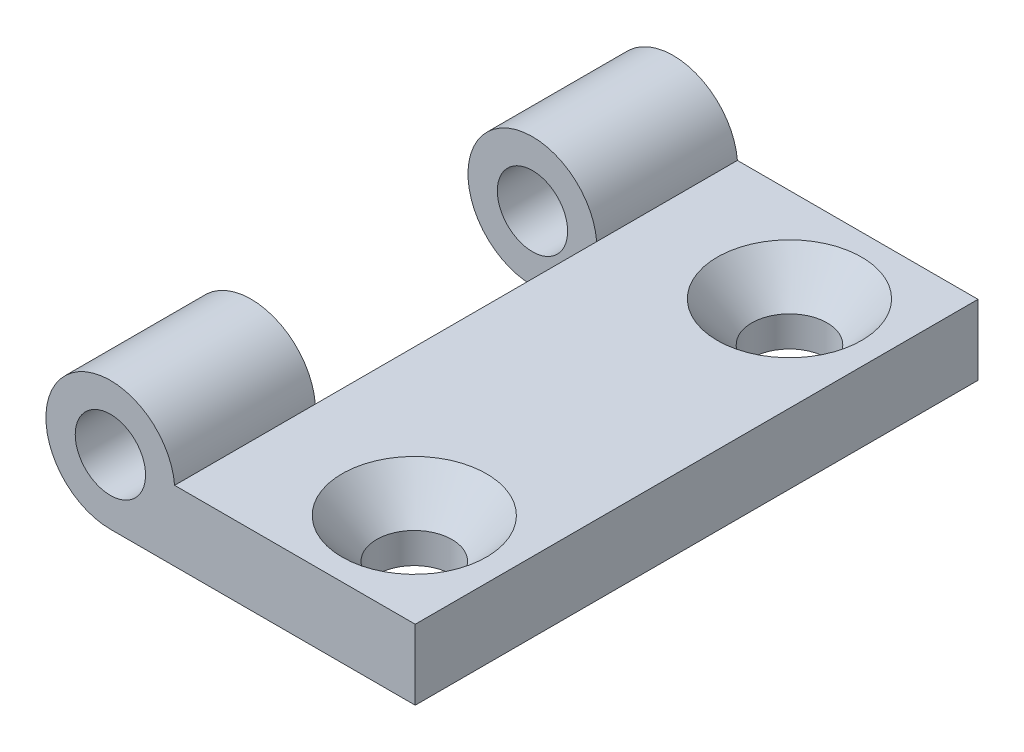
ISO-10303-21;
HEADER;
FILE_DESCRIPTION(('STEP AP214'),'2;1');
FILE_NAME('part.step','',(''),(''),'','','');
FILE_SCHEMA(('AUTOMOTIVE_DESIGN { 1 0 10303 214 1 1 1 1 }'));
ENDSEC;
DATA;
#1=APPLICATION_CONTEXT('core data for automotive mechanical design processes');
#2=APPLICATION_PROTOCOL_DEFINITION('international standard','automotive_design',2000,#1);
#3=PRODUCT_CONTEXT('',#1,'mechanical');
#4=PRODUCT('Part','Part','',(#3));
#5=PRODUCT_RELATED_PRODUCT_CATEGORY('part','',(#4));
#6=PRODUCT_DEFINITION_FORMATION('','',#4);
#7=PRODUCT_DEFINITION_CONTEXT('part definition',#1,'design');
#8=PRODUCT_DEFINITION('design','',#6,#7);
#9=PRODUCT_DEFINITION_SHAPE('','',#8);
#10=(LENGTH_UNIT() NAMED_UNIT(*) SI_UNIT(.MILLI.,.METRE.));
#11=(NAMED_UNIT(*) PLANE_ANGLE_UNIT() SI_UNIT($,.RADIAN.));
#12=(NAMED_UNIT(*) SI_UNIT($,.STERADIAN.) SOLID_ANGLE_UNIT());
#13=UNCERTAINTY_MEASURE_WITH_UNIT(LENGTH_MEASURE(1.E-05),#10,'distance_accuracy_value','');
#14=(GEOMETRIC_REPRESENTATION_CONTEXT(3) GLOBAL_UNCERTAINTY_ASSIGNED_CONTEXT((#13)) GLOBAL_UNIT_ASSIGNED_CONTEXT((#10,
#11,#12)) REPRESENTATION_CONTEXT('',''));
#15=CARTESIAN_POINT('',(0.,0.,0.));
#16=DIRECTION('',(0.,0.,1.));
#17=DIRECTION('',(1.,0.,0.));
#18=AXIS2_PLACEMENT_3D('',#15,#16,#17);
#19=CARTESIAN_POINT('',(0.,4.365625,19.05));
#20=DIRECTION('',(0.,0.,-1.));
#21=DIRECTION('',(-1.,0.,0.));
#22=AXIS2_PLACEMENT_3D('',#19,#20,#21);
#23=CYLINDRICAL_SURFACE('',#22,4.365625);
#24=CARTESIAN_POINT('',(0.,4.365625,-9.525));
#25=DIRECTION('',(0.,0.,-1.));
#26=DIRECTION('',(-1.,0.,0.));
#27=AXIS2_PLACEMENT_3D('',#24,#25,#26);
#28=CIRCLE('',#27,4.365625);
#29=CARTESIAN_POINT('',(0.,0.,-9.525));
#30=VERTEX_POINT('',#29);
#31=CARTESIAN_POINT('',(4.34868844710678,4.7498,-9.525));
#32=VERTEX_POINT('',#31);
#33=EDGE_CURVE('E107',#30,#32,#28,.T.);
#34=ORIENTED_EDGE('',*,*,#33,.T.);
#35=DIRECTION('',(0.,0.,-1.));
#36=VECTOR('',#35,1.);
#37=CARTESIAN_POINT('',(4.34868844710678,4.7498,19.05));
#38=LINE('',#37,#36);
#39=CARTESIAN_POINT('',(4.34868844710678,4.7498,-19.05));
#40=VERTEX_POINT('',#39);
#41=EDGE_CURVE('E112',#32,#40,#38,.T.);
#42=ORIENTED_EDGE('',*,*,#41,.T.);
#43=CARTESIAN_POINT('',(0.,4.365625,-19.05));
#44=DIRECTION('',(0.,0.,1.));
#45=DIRECTION('',(-1.,0.,0.));
#46=AXIS2_PLACEMENT_3D('',#43,#44,#45);
#47=CIRCLE('',#46,4.365625);
#48=CARTESIAN_POINT('',(0.,0.,-19.05));
#49=VERTEX_POINT('',#48);
#50=EDGE_CURVE('E169',#40,#49,#47,.T.);
#51=ORIENTED_EDGE('',*,*,#50,.T.);
#52=DIRECTION('',(0.,0.,-1.));
#53=VECTOR('',#52,1.);
#54=CARTESIAN_POINT('',(0.,0.,19.05));
#55=LINE('',#54,#53);
#56=EDGE_CURVE('E114',#30,#49,#55,.T.);
#57=ORIENTED_EDGE('',*,*,#56,.F.);
#58=EDGE_LOOP('',(#34,#42,#51,#57));
#59=FACE_BOUND('',#58,.T.);
#60=ADVANCED_FACE('F34',(#59),#23,.T.);
#61=CARTESIAN_POINT('',(0.,4.365625,19.05));
#62=DIRECTION('',(0.,0.,-1.));
#63=DIRECTION('',(-1.,0.,0.));
#64=AXIS2_PLACEMENT_3D('',#61,#62,#63);
#65=CYLINDRICAL_SURFACE('',#64,2.38125);
#66=CARTESIAN_POINT('',(0.,4.365625,-19.05));
#67=DIRECTION('',(0.,0.,1.));
#68=DIRECTION('',(1.,0.,0.));
#69=AXIS2_PLACEMENT_3D('',#66,#67,#68);
#70=CIRCLE('',#69,2.38125);
#71=CARTESIAN_POINT('',(-2.38125,4.365625,-19.05));
#72=VERTEX_POINT('',#71);
#73=EDGE_CURVE('E152',#72,#72,#70,.T.);
#74=CARTESIAN_POINT('',(0.,4.365625,-9.525));
#75=DIRECTION('',(0.,0.,1.));
#76=DIRECTION('',(1.,0.,0.));
#77=AXIS2_PLACEMENT_3D('',#74,#75,#76);
#78=CIRCLE('',#77,2.38125);
#79=CARTESIAN_POINT('',(-2.38125,4.365625,-9.52500000000001));
#80=VERTEX_POINT('',#79);
#81=EDGE_CURVE('E125',#80,#80,#78,.T.);
#82=CARTESIAN_POINT('',(-2.38125,4.365625,-19.05));
#83=CARTESIAN_POINT('',(-2.38125,4.365625,-18.95078125));
#84=CARTESIAN_POINT('',(-2.38125,4.365625,-18.8515625));
#85=CARTESIAN_POINT('',(-2.38125,4.365625,-18.653125));
#86=CARTESIAN_POINT('',(-2.38125,4.365625,-18.55390625));
#87=CARTESIAN_POINT('',(-2.38125,4.365625,-18.35546875));
#88=CARTESIAN_POINT('',(-2.38125,4.365625,-18.25625));
#89=CARTESIAN_POINT('',(-2.38125,4.365625,-18.0578125));
#90=CARTESIAN_POINT('',(-2.38125,4.365625,-17.95859375));
#91=CARTESIAN_POINT('',(-2.38125,4.365625,-17.76015625));
#92=CARTESIAN_POINT('',(-2.38125,4.365625,-17.6609375));
#93=CARTESIAN_POINT('',(-2.38125,4.365625,-17.4625));
#94=CARTESIAN_POINT('',(-2.38125,4.365625,-17.36328125));
#95=CARTESIAN_POINT('',(-2.38125,4.365625,-17.16484375));
#96=CARTESIAN_POINT('',(-2.38125,4.365625,-17.065625));
#97=CARTESIAN_POINT('',(-2.38125,4.365625,-16.8671875));
#98=CARTESIAN_POINT('',(-2.38125,4.365625,-16.76796875));
#99=CARTESIAN_POINT('',(-2.38125,4.365625,-16.56953125));
#100=CARTESIAN_POINT('',(-2.38125,4.365625,-16.4703125));
#101=CARTESIAN_POINT('',(-2.38125,4.365625,-16.271875));
#102=CARTESIAN_POINT('',(-2.38125,4.365625,-16.17265625));
#103=CARTESIAN_POINT('',(-2.38125,4.365625,-15.97421875));
#104=CARTESIAN_POINT('',(-2.38125,4.365625,-15.875));
#105=CARTESIAN_POINT('',(-2.38125,4.365625,-15.6765625));
#106=CARTESIAN_POINT('',(-2.38125,4.365625,-15.57734375));
#107=CARTESIAN_POINT('',(-2.38125,4.365625,-15.37890625));
#108=CARTESIAN_POINT('',(-2.38125,4.365625,-15.2796875));
#109=CARTESIAN_POINT('',(-2.38125,4.365625,-15.08125));
#110=CARTESIAN_POINT('',(-2.38125,4.365625,-14.98203125));
#111=CARTESIAN_POINT('',(-2.38125,4.365625,-14.78359375));
#112=CARTESIAN_POINT('',(-2.38125,4.365625,-14.684375));
#113=CARTESIAN_POINT('',(-2.38125,4.365625,-14.4859375));
#114=CARTESIAN_POINT('',(-2.38125,4.365625,-14.38671875));
#115=CARTESIAN_POINT('',(-2.38125,4.365625,-14.18828125));
#116=CARTESIAN_POINT('',(-2.38125,4.365625,-14.0890625));
#117=CARTESIAN_POINT('',(-2.38125,4.365625,-13.890625));
#118=CARTESIAN_POINT('',(-2.38125,4.365625,-13.79140625));
#119=CARTESIAN_POINT('',(-2.38125,4.365625,-13.59296875));
#120=CARTESIAN_POINT('',(-2.38125,4.365625,-13.49375));
#121=CARTESIAN_POINT('',(-2.38125,4.365625,-13.2953125));
#122=CARTESIAN_POINT('',(-2.38125,4.365625,-13.19609375));
#123=CARTESIAN_POINT('',(-2.38125,4.365625,-12.99765625));
#124=CARTESIAN_POINT('',(-2.38125,4.365625,-12.8984375));
#125=CARTESIAN_POINT('',(-2.38125,4.365625,-12.7));
#126=CARTESIAN_POINT('',(-2.38125,4.365625,-12.60078125));
#127=CARTESIAN_POINT('',(-2.38125,4.365625,-12.40234375));
#128=CARTESIAN_POINT('',(-2.38125,4.365625,-12.303125));
#129=CARTESIAN_POINT('',(-2.38125,4.365625,-12.1046875));
#130=CARTESIAN_POINT('',(-2.38125,4.365625,-12.00546875));
#131=CARTESIAN_POINT('',(-2.38125,4.365625,-11.80703125));
#132=CARTESIAN_POINT('',(-2.38125,4.365625,-11.7078125));
#133=CARTESIAN_POINT('',(-2.38125,4.365625,-11.509375));
#134=CARTESIAN_POINT('',(-2.38125,4.365625,-11.41015625));
#135=CARTESIAN_POINT('',(-2.38125,4.365625,-11.21171875));
#136=CARTESIAN_POINT('',(-2.38125,4.365625,-11.1125));
#137=CARTESIAN_POINT('',(-2.38125,4.365625,-10.9140625));
#138=CARTESIAN_POINT('',(-2.38125,4.365625,-10.81484375));
#139=CARTESIAN_POINT('',(-2.38125,4.365625,-10.61640625));
#140=CARTESIAN_POINT('',(-2.38125,4.365625,-10.5171875));
#141=CARTESIAN_POINT('',(-2.38125,4.365625,-10.31875));
#142=CARTESIAN_POINT('',(-2.38125,4.365625,-10.21953125));
#143=CARTESIAN_POINT('',(-2.38125,4.365625,-10.02109375));
#144=CARTESIAN_POINT('',(-2.38125,4.365625,-9.92187500000001));
#145=CARTESIAN_POINT('',(-2.38125,4.365625,-9.72343750000001));
#146=CARTESIAN_POINT('',(-2.38125,4.365625,-9.62421875000001));
#147=CARTESIAN_POINT('',(-2.38125,4.365625,-9.52500000000001));
#148=B_SPLINE_CURVE_WITH_KNOTS('',3,(#82,#83,#84,#85,#86,#87,#88,#89,#90,#91,#92,#93,#94,#95,
#96,#97,#98,#99,#100,#101,#102,#103,#104,#105,#106,#107,#108,#109,#110,#111,#112,#113,#114,#115,
#116,#117,#118,#119,#120,#121,#122,#123,#124,#125,#126,#127,#128,#129,#130,#131,#132,#133,#134,
#135,#136,#137,#138,#139,#140,#141,#142,#143,#144,#145,#146,#147),.UNSPECIFIED.,.F.,.F.,(4,2,2,
2,2,2,2,2,2,2,2,2,2,2,2,2,2,2,2,2,2,2,2,2,2,2,2,2,2,2,2,2,4),(0.,0.29765625,0.5953125,
0.892968750000001,1.190625,1.48828125,1.7859375,2.08359375,2.38125,2.67890625,2.9765625,
3.27421875,3.571875,3.86953125,4.1671875,4.46484375,4.7625,5.06015625,5.3578125,5.65546875,
5.953125,6.25078125,6.5484375,6.84609375,7.14374999999999,7.44140624999999,7.73906249999999,
8.03671875,8.33437499999999,8.63203125,8.92968749999999,9.22734375,9.525),.UNSPECIFIED.);
#149=EDGE_CURVE('BSEAM190',#72,#80,#148,.T.);
#150=ORIENTED_EDGE('',*,*,#73,.F.);
#151=ORIENTED_EDGE('',*,*,#81,.T.);
#152=ORIENTED_EDGE('',*,*,#149,.T.);
#153=ORIENTED_EDGE('',*,*,#149,.F.);
#154=EDGE_LOOP('',(#150,#152,#151,#153));
#155=FACE_BOUND('',#154,.T.);
#156=ADVANCED_FACE('F190',(#155),#65,.F.);
#157=CARTESIAN_POINT('',(0.,4.365625,19.05));
#158=DIRECTION('',(0.,0.,1.));
#159=DIRECTION('',(1.,0.,0.));
#160=AXIS2_PLACEMENT_3D('',#157,#158,#159);
#161=PLANE('',#160);
#162=DIRECTION('',(0.,1.,0.));
#163=VECTOR('',#162,1.);
#164=CARTESIAN_POINT('',(20.6375,0.,19.05));
#165=LINE('',#164,#163);
#166=CARTESIAN_POINT('',(20.6375,0.,19.05));
#167=VERTEX_POINT('',#166);
#168=CARTESIAN_POINT('',(20.6375,4.74980000000001,19.05));
#169=VERTEX_POINT('',#168);
#170=EDGE_CURVE('E159',#167,#169,#165,.T.);
#171=ORIENTED_EDGE('',*,*,#170,.T.);
#172=DIRECTION('',(-1.,0.,0.));
#173=VECTOR('',#172,1.);
#174=CARTESIAN_POINT('',(4.34868844710678,4.7498,19.05));
#175=LINE('',#174,#173);
#176=CARTESIAN_POINT('',(4.34868844710678,4.7498,19.05));
#177=VERTEX_POINT('',#176);
#178=EDGE_CURVE('E87',#169,#177,#175,.T.);
#179=ORIENTED_EDGE('',*,*,#178,.T.);
#180=CARTESIAN_POINT('',(0.,4.365625,19.05));
#181=DIRECTION('',(0.,0.,1.));
#182=DIRECTION('',(1.,0.,0.));
#183=AXIS2_PLACEMENT_3D('',#180,#181,#182);
#184=CIRCLE('',#183,4.365625);
#185=CARTESIAN_POINT('',(0.,0.,19.05));
#186=VERTEX_POINT('',#185);
#187=EDGE_CURVE('E162',#177,#186,#184,.T.);
#188=ORIENTED_EDGE('',*,*,#187,.T.);
#189=DIRECTION('',(1.,0.,0.));
#190=VECTOR('',#189,1.);
#191=CARTESIAN_POINT('',(20.6375,0.,19.05));
#192=LINE('',#191,#190);
#193=EDGE_CURVE('E60',#186,#167,#192,.T.);
#194=ORIENTED_EDGE('',*,*,#193,.T.);
#195=EDGE_LOOP('',(#171,#179,#188,#194));
#196=FACE_BOUND('',#195,.T.);
#197=CARTESIAN_POINT('',(0.,4.365625,19.05));
#198=DIRECTION('',(0.,0.,1.));
#199=DIRECTION('',(1.,0.,0.));
#200=AXIS2_PLACEMENT_3D('',#197,#198,#199);
#201=CIRCLE('',#200,2.38125);
#202=CARTESIAN_POINT('',(-2.38125,4.365625,19.05));
#203=VERTEX_POINT('',#202);
#204=EDGE_CURVE('E153',#203,#203,#201,.T.);
#205=ORIENTED_EDGE('',*,*,#204,.F.);
#206=EDGE_LOOP('',(#205));
#207=FACE_BOUND('',#206,.T.);
#208=ADVANCED_FACE('F180',(#196,#207),#161,.T.);
#209=CARTESIAN_POINT('',(0.,4.365625,-19.05));
#210=DIRECTION('',(0.,0.,1.));
#211=DIRECTION('',(1.,0.,0.));
#212=AXIS2_PLACEMENT_3D('',#209,#210,#211);
#213=PLANE('',#212);
#214=DIRECTION('',(0.,1.,0.));
#215=VECTOR('',#214,1.);
#216=CARTESIAN_POINT('',(20.6375,0.,-19.05));
#217=LINE('',#216,#215);
#218=CARTESIAN_POINT('',(20.6375,0.,-19.05));
#219=VERTEX_POINT('',#218);
#220=CARTESIAN_POINT('',(20.6375,4.74980000000001,-19.05));
#221=VERTEX_POINT('',#220);
#222=EDGE_CURVE('E156',#219,#221,#217,.T.);
#223=ORIENTED_EDGE('',*,*,#222,.F.);
#224=DIRECTION('',(1.,0.,0.));
#225=VECTOR('',#224,1.);
#226=CARTESIAN_POINT('',(20.6375,0.,-19.05));
#227=LINE('',#226,#225);
#228=EDGE_CURVE('E80',#49,#219,#227,.T.);
#229=ORIENTED_EDGE('',*,*,#228,.F.);
#230=ORIENTED_EDGE('',*,*,#50,.F.);
#231=DIRECTION('',(-1.,0.,0.));
#232=VECTOR('',#231,1.);
#233=CARTESIAN_POINT('',(4.34868844710678,4.7498,-19.05));
#234=LINE('',#233,#232);
#235=EDGE_CURVE('E118',#221,#40,#234,.T.);
#236=ORIENTED_EDGE('',*,*,#235,.F.);
#237=EDGE_LOOP('',(#223,#229,#230,#236));
#238=FACE_BOUND('',#237,.T.);
#239=ORIENTED_EDGE('',*,*,#73,.T.);
#240=EDGE_LOOP('',(#239));
#241=FACE_BOUND('',#240,.T.);
#242=ADVANCED_FACE('F184',(#238,#241),#213,.F.);
#243=CARTESIAN_POINT('',(20.6375,0.,19.05));
#244=DIRECTION('',(-1.,0.,0.));
#245=DIRECTION('',(0.,0.,1.));
#246=AXIS2_PLACEMENT_3D('',#243,#244,#245);
#247=PLANE('',#246);
#248=ORIENTED_EDGE('',*,*,#222,.T.);
#249=DIRECTION('',(0.,0.,-1.));
#250=VECTOR('',#249,1.);
#251=CARTESIAN_POINT('',(20.6375,4.74980000000001,19.05));
#252=LINE('',#251,#250);
#253=EDGE_CURVE('E11',#169,#221,#252,.T.);
#254=ORIENTED_EDGE('',*,*,#253,.F.);
#255=ORIENTED_EDGE('',*,*,#170,.F.);
#256=DIRECTION('',(0.,0.,-1.));
#257=VECTOR('',#256,1.);
#258=CARTESIAN_POINT('',(20.6375,0.,19.05));
#259=LINE('',#258,#257);
#260=EDGE_CURVE('E165',#167,#219,#259,.T.);
#261=ORIENTED_EDGE('',*,*,#260,.T.);
#262=EDGE_LOOP('',(#248,#254,#255,#261));
#263=FACE_BOUND('',#262,.T.);
#264=ADVANCED_FACE('F36',(#263),#247,.F.);
#265=CARTESIAN_POINT('',(4.34868844710678,4.7498,19.05));
#266=DIRECTION('',(0.,-1.,0.));
#267=DIRECTION('',(1.,0.,0.));
#268=AXIS2_PLACEMENT_3D('',#265,#266,#267);
#269=PLANE('',#268);
#270=CARTESIAN_POINT('',(14.224,4.74980000000001,12.7));
#271=DIRECTION('',(0.,1.,0.));
#272=DIRECTION('',(0.,0.,1.));
#273=AXIS2_PLACEMENT_3D('',#270,#271,#272);
#274=CIRCLE('',#273,4.8895);
#275=CARTESIAN_POINT('',(14.224,4.74980000000001,17.5895));
#276=VERTEX_POINT('',#275);
#277=EDGE_CURVE('E140',#276,#276,#274,.T.);
#278=ORIENTED_EDGE('',*,*,#277,.F.);
#279=EDGE_LOOP('',(#278));
#280=FACE_BOUND('',#279,.T.);
#281=CARTESIAN_POINT('',(14.224,4.74980000000001,-12.7));
#282=DIRECTION('',(0.,1.,0.));
#283=DIRECTION('',(0.,0.,1.));
#284=AXIS2_PLACEMENT_3D('',#281,#282,#283);
#285=CIRCLE('',#284,4.8895);
#286=CARTESIAN_POINT('',(14.224,4.74980000000001,-7.8105));
#287=VERTEX_POINT('',#286);
#288=EDGE_CURVE('E149',#287,#287,#285,.T.);
#289=ORIENTED_EDGE('',*,*,#288,.F.);
#290=EDGE_LOOP('',(#289));
#291=FACE_BOUND('',#290,.T.);
#292=ORIENTED_EDGE('',*,*,#235,.T.);
#293=ORIENTED_EDGE('',*,*,#41,.F.);
#294=DIRECTION('',(0.,0.,-1.));
#295=VECTOR('',#294,1.);
#296=CARTESIAN_POINT('',(4.34868844710678,4.7498,9.525));
#297=LINE('',#296,#295);
#298=CARTESIAN_POINT('',(4.34868844710678,4.7498,9.525));
#299=VERTEX_POINT('',#298);
#300=EDGE_CURVE('E95',#32,#299,#297,.F.);
#301=ORIENTED_EDGE('',*,*,#300,.T.);
#302=EDGE_CURVE('E43',#177,#299,#38,.T.);
#303=ORIENTED_EDGE('',*,*,#302,.F.);
#304=ORIENTED_EDGE('',*,*,#178,.F.);
#305=ORIENTED_EDGE('',*,*,#253,.T.);
#306=EDGE_LOOP('',(#292,#293,#301,#303,#304,#305));
#307=FACE_BOUND('',#306,.T.);
#308=ADVANCED_FACE('F117',(#280,#291,#307),#269,.F.);
#309=ORIENTED_EDGE('',*,*,#302,.T.);
#310=CARTESIAN_POINT('',(0.,4.365625,9.525));
#311=DIRECTION('',(0.,0.,-1.));
#312=DIRECTION('',(1.,0.,0.));
#313=AXIS2_PLACEMENT_3D('',#310,#311,#312);
#314=CIRCLE('',#313,4.365625);
#315=CARTESIAN_POINT('',(0.,0.,9.525));
#316=VERTEX_POINT('',#315);
#317=EDGE_CURVE('E127',#316,#299,#314,.T.);
#318=ORIENTED_EDGE('',*,*,#317,.F.);
#319=EDGE_CURVE('E119',#186,#316,#55,.T.);
#320=ORIENTED_EDGE('',*,*,#319,.F.);
#321=ORIENTED_EDGE('',*,*,#187,.F.);
#322=EDGE_LOOP('',(#309,#318,#320,#321));
#323=FACE_BOUND('',#322,.T.);
#324=ADVANCED_FACE('F178',(#323),#23,.T.);
#325=CARTESIAN_POINT('',(20.6375,0.,19.05));
#326=DIRECTION('',(0.,1.,0.));
#327=DIRECTION('',(-1.,0.,0.));
#328=AXIS2_PLACEMENT_3D('',#325,#326,#327);
#329=PLANE('',#328);
#330=CARTESIAN_POINT('',(14.224,0.,12.7));
#331=DIRECTION('',(0.,1.,0.));
#332=DIRECTION('',(0.,0.,1.));
#333=AXIS2_PLACEMENT_3D('',#330,#331,#332);
#334=CIRCLE('',#333,2.5527);
#335=CARTESIAN_POINT('',(14.224,0.,15.2527));
#336=VERTEX_POINT('',#335);
#337=EDGE_CURVE('E102',#336,#336,#334,.T.);
#338=ORIENTED_EDGE('',*,*,#337,.T.);
#339=EDGE_LOOP('',(#338));
#340=FACE_BOUND('',#339,.T.);
#341=CARTESIAN_POINT('',(14.224,0.,-12.7));
#342=DIRECTION('',(0.,1.,0.));
#343=DIRECTION('',(0.,0.,1.));
#344=AXIS2_PLACEMENT_3D('',#341,#342,#343);
#345=CIRCLE('',#344,2.5527);
#346=CARTESIAN_POINT('',(14.224,0.,-10.1473));
#347=VERTEX_POINT('',#346);
#348=EDGE_CURVE('E143',#347,#347,#345,.T.);
#349=ORIENTED_EDGE('',*,*,#348,.T.);
#350=EDGE_LOOP('',(#349));
#351=FACE_BOUND('',#350,.T.);
#352=ORIENTED_EDGE('',*,*,#228,.T.);
#353=ORIENTED_EDGE('',*,*,#260,.F.);
#354=ORIENTED_EDGE('',*,*,#193,.F.);
#355=ORIENTED_EDGE('',*,*,#319,.T.);
#356=EDGE_CURVE('E122',#316,#30,#55,.T.);
#357=ORIENTED_EDGE('',*,*,#356,.T.);
#358=ORIENTED_EDGE('',*,*,#56,.T.);
#359=EDGE_LOOP('',(#352,#353,#354,#355,#357,#358));
#360=FACE_BOUND('',#359,.T.);
#361=ADVANCED_FACE('F174',(#340,#351,#360),#329,.F.);
#362=CARTESIAN_POINT('',(0.,4.365625,9.525));
#363=DIRECTION('',(0.,0.,1.));
#364=DIRECTION('',(1.,0.,0.));
#365=AXIS2_PLACEMENT_3D('',#362,#363,#364);
#366=CIRCLE('',#365,2.38125);
#367=CARTESIAN_POINT('',(-2.38125,4.365625,9.525));
#368=VERTEX_POINT('',#367);
#369=EDGE_CURVE('E38',#368,#368,#366,.T.);
#370=CARTESIAN_POINT('',(-2.38125,4.365625,9.525));
#371=CARTESIAN_POINT('',(-2.38125,4.365625,9.62421875));
#372=CARTESIAN_POINT('',(-2.38125,4.365625,9.7234375));
#373=CARTESIAN_POINT('',(-2.38125,4.365625,9.921875));
#374=CARTESIAN_POINT('',(-2.38125,4.365625,10.02109375));
#375=CARTESIAN_POINT('',(-2.38125,4.365625,10.21953125));
#376=CARTESIAN_POINT('',(-2.38125,4.365625,10.31875));
#377=CARTESIAN_POINT('',(-2.38125,4.365625,10.5171875));
#378=CARTESIAN_POINT('',(-2.38125,4.365625,10.61640625));
#379=CARTESIAN_POINT('',(-2.38125,4.365625,10.81484375));
#380=CARTESIAN_POINT('',(-2.38125,4.365625,10.9140625));
#381=CARTESIAN_POINT('',(-2.38125,4.365625,11.1125));
#382=CARTESIAN_POINT('',(-2.38125,4.365625,11.21171875));
#383=CARTESIAN_POINT('',(-2.38125,4.365625,11.41015625));
#384=CARTESIAN_POINT('',(-2.38125,4.365625,11.509375));
#385=CARTESIAN_POINT('',(-2.38125,4.365625,11.7078125));
#386=CARTESIAN_POINT('',(-2.38125,4.365625,11.80703125));
#387=CARTESIAN_POINT('',(-2.38125,4.365625,12.00546875));
#388=CARTESIAN_POINT('',(-2.38125,4.365625,12.1046875));
#389=CARTESIAN_POINT('',(-2.38125,4.365625,12.303125));
#390=CARTESIAN_POINT('',(-2.38125,4.365625,12.40234375));
#391=CARTESIAN_POINT('',(-2.38125,4.365625,12.60078125));
#392=CARTESIAN_POINT('',(-2.38125,4.365625,12.7));
#393=CARTESIAN_POINT('',(-2.38125,4.365625,12.8984375));
#394=CARTESIAN_POINT('',(-2.38125,4.365625,12.99765625));
#395=CARTESIAN_POINT('',(-2.38125,4.365625,13.19609375));
#396=CARTESIAN_POINT('',(-2.38125,4.365625,13.2953125));
#397=CARTESIAN_POINT('',(-2.38125,4.365625,13.49375));
#398=CARTESIAN_POINT('',(-2.38125,4.365625,13.59296875));
#399=CARTESIAN_POINT('',(-2.38125,4.365625,13.79140625));
#400=CARTESIAN_POINT('',(-2.38125,4.365625,13.890625));
#401=CARTESIAN_POINT('',(-2.38125,4.365625,14.0890625));
#402=CARTESIAN_POINT('',(-2.38125,4.365625,14.18828125));
#403=CARTESIAN_POINT('',(-2.38125,4.365625,14.38671875));
#404=CARTESIAN_POINT('',(-2.38125,4.365625,14.4859375));
#405=CARTESIAN_POINT('',(-2.38125,4.365625,14.684375));
#406=CARTESIAN_POINT('',(-2.38125,4.365625,14.78359375));
#407=CARTESIAN_POINT('',(-2.38125,4.365625,14.98203125));
#408=CARTESIAN_POINT('',(-2.38125,4.365625,15.08125));
#409=CARTESIAN_POINT('',(-2.38125,4.365625,15.2796875));
#410=CARTESIAN_POINT('',(-2.38125,4.365625,15.37890625));
#411=CARTESIAN_POINT('',(-2.38125,4.365625,15.57734375));
#412=CARTESIAN_POINT('',(-2.38125,4.365625,15.6765625));
#413=CARTESIAN_POINT('',(-2.38125,4.365625,15.875));
#414=CARTESIAN_POINT('',(-2.38125,4.365625,15.97421875));
#415=CARTESIAN_POINT('',(-2.38125,4.365625,16.17265625));
#416=CARTESIAN_POINT('',(-2.38125,4.365625,16.271875));
#417=CARTESIAN_POINT('',(-2.38125,4.365625,16.4703125));
#418=CARTESIAN_POINT('',(-2.38125,4.365625,16.56953125));
#419=CARTESIAN_POINT('',(-2.38125,4.365625,16.76796875));
#420=CARTESIAN_POINT('',(-2.38125,4.365625,16.8671875));
#421=CARTESIAN_POINT('',(-2.38125,4.365625,17.065625));
#422=CARTESIAN_POINT('',(-2.38125,4.365625,17.16484375));
#423=CARTESIAN_POINT('',(-2.38125,4.365625,17.36328125));
#424=CARTESIAN_POINT('',(-2.38125,4.365625,17.4625));
#425=CARTESIAN_POINT('',(-2.38125,4.365625,17.6609375));
#426=CARTESIAN_POINT('',(-2.38125,4.365625,17.76015625));
#427=CARTESIAN_POINT('',(-2.38125,4.365625,17.95859375));
#428=CARTESIAN_POINT('',(-2.38125,4.365625,18.0578125));
#429=CARTESIAN_POINT('',(-2.38125,4.365625,18.25625));
#430=CARTESIAN_POINT('',(-2.38125,4.365625,18.35546875));
#431=CARTESIAN_POINT('',(-2.38125,4.365625,18.55390625));
#432=CARTESIAN_POINT('',(-2.38125,4.365625,18.653125));
#433=CARTESIAN_POINT('',(-2.38125,4.365625,18.8515625));
#434=CARTESIAN_POINT('',(-2.38125,4.365625,18.95078125));
#435=CARTESIAN_POINT('',(-2.38125,4.365625,19.05));
#436=B_SPLINE_CURVE_WITH_KNOTS('',3,(#370,#371,#372,#373,#374,#375,#376,#377,#378,#379,#380,
#381,#382,#383,#384,#385,#386,#387,#388,#389,#390,#391,#392,#393,#394,#395,#396,#397,#398,#399,
#400,#401,#402,#403,#404,#405,#406,#407,#408,#409,#410,#411,#412,#413,#414,#415,#416,#417,#418,
#419,#420,#421,#422,#423,#424,#425,#426,#427,#428,#429,#430,#431,#432,#433,#434,#435),
.UNSPECIFIED.,.F.,.F.,(4,2,2,2,2,2,2,2,2,2,2,2,2,2,2,2,2,2,2,2,2,2,2,2,2,2,2,2,2,2,2,2,4),(0.,
0.29765625,0.5953125,0.892968750000001,1.190625,1.48828125,1.7859375,2.08359375,2.38125,
2.67890625,2.9765625,3.27421875,3.571875,3.86953125,4.1671875,4.46484375,4.7625,5.06015625,
5.3578125,5.65546875,5.953125,6.25078125,6.5484375,6.84609375,7.14375,7.44140625,7.7390625,
8.03671875,8.334375,8.63203125,8.9296875,9.22734375,9.525),.UNSPECIFIED.);
#437=EDGE_CURVE('BSEAM193',#368,#203,#436,.T.);
#438=ORIENTED_EDGE('',*,*,#369,.F.);
#439=ORIENTED_EDGE('',*,*,#204,.T.);
#440=ORIENTED_EDGE('',*,*,#437,.T.);
#441=ORIENTED_EDGE('',*,*,#437,.F.);
#442=EDGE_LOOP('',(#438,#440,#439,#441));
#443=FACE_BOUND('',#442,.T.);
#444=ADVANCED_FACE('F193',(#443),#65,.F.);
#445=CARTESIAN_POINT('',(14.224,4.74980000000001,-12.7));
#446=DIRECTION('',(0.,1.,0.));
#447=DIRECTION('',(0.,0.,1.));
#448=AXIS2_PLACEMENT_3D('',#445,#446,#447);
#449=CONICAL_SURFACE('',#448,4.8895,0.715584993317676);
#450=CARTESIAN_POINT('',(14.224,2.06161910600595,-12.7));
#451=DIRECTION('',(0.,1.,0.));
#452=DIRECTION('',(0.,0.,1.));
#453=AXIS2_PLACEMENT_3D('',#450,#451,#452);
#454=CIRCLE('',#453,2.5527);
#455=CARTESIAN_POINT('',(14.224,2.06161910600595,-10.1473));
#456=VERTEX_POINT('',#455);
#457=EDGE_CURVE('E146',#456,#456,#454,.T.);
#458=ORIENTED_EDGE('',*,*,#457,.F.);
#459=EDGE_LOOP('',(#458));
#460=FACE_BOUND('',#459,.T.);
#461=ORIENTED_EDGE('',*,*,#288,.T.);
#462=EDGE_LOOP('',(#461));
#463=FACE_BOUND('',#462,.T.);
#464=ADVANCED_FACE('F202',(#460,#463),#449,.F.);
#465=CARTESIAN_POINT('',(14.224,4.74980000000001,-12.7));
#466=DIRECTION('',(0.,1.,0.));
#467=DIRECTION('',(0.,0.,1.));
#468=AXIS2_PLACEMENT_3D('',#465,#466,#467);
#469=CYLINDRICAL_SURFACE('',#468,2.5527);
#470=ORIENTED_EDGE('',*,*,#348,.F.);
#471=EDGE_LOOP('',(#470));
#472=FACE_BOUND('',#471,.T.);
#473=ORIENTED_EDGE('',*,*,#457,.T.);
#474=EDGE_LOOP('',(#473));
#475=FACE_BOUND('',#474,.T.);
#476=ADVANCED_FACE('F208',(#472,#475),#469,.F.);
#477=CARTESIAN_POINT('',(14.224,4.74980000000001,12.7));
#478=DIRECTION('',(0.,1.,0.));
#479=DIRECTION('',(0.,0.,1.));
#480=AXIS2_PLACEMENT_3D('',#477,#478,#479);
#481=CONICAL_SURFACE('',#480,4.8895,0.715584993317675);
#482=CARTESIAN_POINT('',(14.224,2.06161910600595,12.7));
#483=DIRECTION('',(0.,1.,0.));
#484=DIRECTION('',(0.,0.,1.));
#485=AXIS2_PLACEMENT_3D('',#482,#483,#484);
#486=CIRCLE('',#485,2.5527);
#487=CARTESIAN_POINT('',(14.224,2.06161910600595,15.2527));
#488=VERTEX_POINT('',#487);
#489=EDGE_CURVE('E137',#488,#488,#486,.T.);
#490=ORIENTED_EDGE('',*,*,#489,.F.);
#491=EDGE_LOOP('',(#490));
#492=FACE_BOUND('',#491,.T.);
#493=ORIENTED_EDGE('',*,*,#277,.T.);
#494=EDGE_LOOP('',(#493));
#495=FACE_BOUND('',#494,.T.);
#496=ADVANCED_FACE('F229',(#492,#495),#481,.F.);
#497=CARTESIAN_POINT('',(14.224,4.74980000000001,12.7));
#498=DIRECTION('',(0.,1.,0.));
#499=DIRECTION('',(0.,0.,1.));
#500=AXIS2_PLACEMENT_3D('',#497,#498,#499);
#501=CYLINDRICAL_SURFACE('',#500,2.5527);
#502=ORIENTED_EDGE('',*,*,#337,.F.);
#503=EDGE_LOOP('',(#502));
#504=FACE_BOUND('',#503,.T.);
#505=ORIENTED_EDGE('',*,*,#489,.T.);
#506=EDGE_LOOP('',(#505));
#507=FACE_BOUND('',#506,.T.);
#508=ADVANCED_FACE('F224',(#504,#507),#501,.F.);
#509=CARTESIAN_POINT('',(0.,4.365625,9.525));
#510=DIRECTION('',(0.,0.,-1.));
#511=DIRECTION('',(-1.,0.,0.));
#512=AXIS2_PLACEMENT_3D('',#509,#510,#511);
#513=CYLINDRICAL_SURFACE('',#512,4.365625);
#514=EDGE_CURVE('E51',#32,#30,#28,.T.);
#515=ORIENTED_EDGE('',*,*,#514,.T.);
#516=ORIENTED_EDGE('',*,*,#356,.F.);
#517=EDGE_CURVE('E98',#299,#316,#314,.T.);
#518=ORIENTED_EDGE('',*,*,#517,.F.);
#519=ORIENTED_EDGE('',*,*,#300,.F.);
#520=EDGE_LOOP('',(#515,#516,#518,#519));
#521=FACE_BOUND('',#520,.T.);
#522=ADVANCED_FACE('F96',(#521),#513,.F.);
#523=CARTESIAN_POINT('',(0.,4.365625,9.525));
#524=DIRECTION('',(0.,0.,1.));
#525=DIRECTION('',(1.,0.,0.));
#526=AXIS2_PLACEMENT_3D('',#523,#524,#525);
#527=PLANE('',#526);
#528=ORIENTED_EDGE('',*,*,#369,.T.);
#529=EDGE_LOOP('',(#528));
#530=FACE_BOUND('',#529,.T.);
#531=ORIENTED_EDGE('',*,*,#317,.T.);
#532=ORIENTED_EDGE('',*,*,#517,.T.);
#533=EDGE_LOOP('',(#531,#532));
#534=FACE_BOUND('',#533,.T.);
#535=ADVANCED_FACE('F176',(#530,#534),#527,.F.);
#536=CARTESIAN_POINT('',(0.,4.365625,-9.525));
#537=DIRECTION('',(0.,0.,1.));
#538=DIRECTION('',(1.,0.,0.));
#539=AXIS2_PLACEMENT_3D('',#536,#537,#538);
#540=PLANE('',#539);
#541=ORIENTED_EDGE('',*,*,#81,.F.);
#542=EDGE_LOOP('',(#541));
#543=FACE_BOUND('',#542,.T.);
#544=ORIENTED_EDGE('',*,*,#514,.F.);
#545=ORIENTED_EDGE('',*,*,#33,.F.);
#546=EDGE_LOOP('',(#544,#545));
#547=FACE_BOUND('',#546,.T.);
#548=ADVANCED_FACE('F106',(#543,#547),#540,.T.);
#549=CLOSED_SHELL('',(#60,#156,#208,#242,#264,#308,#324,#361,#444,#464,#476,#496,#508,#522,#535,#548));
#550=MANIFOLD_SOLID_BREP('B2',#549);
#551=ADVANCED_BREP_SHAPE_REPRESENTATION('',(#18,#550),#14);
#552=SHAPE_DEFINITION_REPRESENTATION(#9,#551);
ENDSEC;
END-ISO-10303-21;
